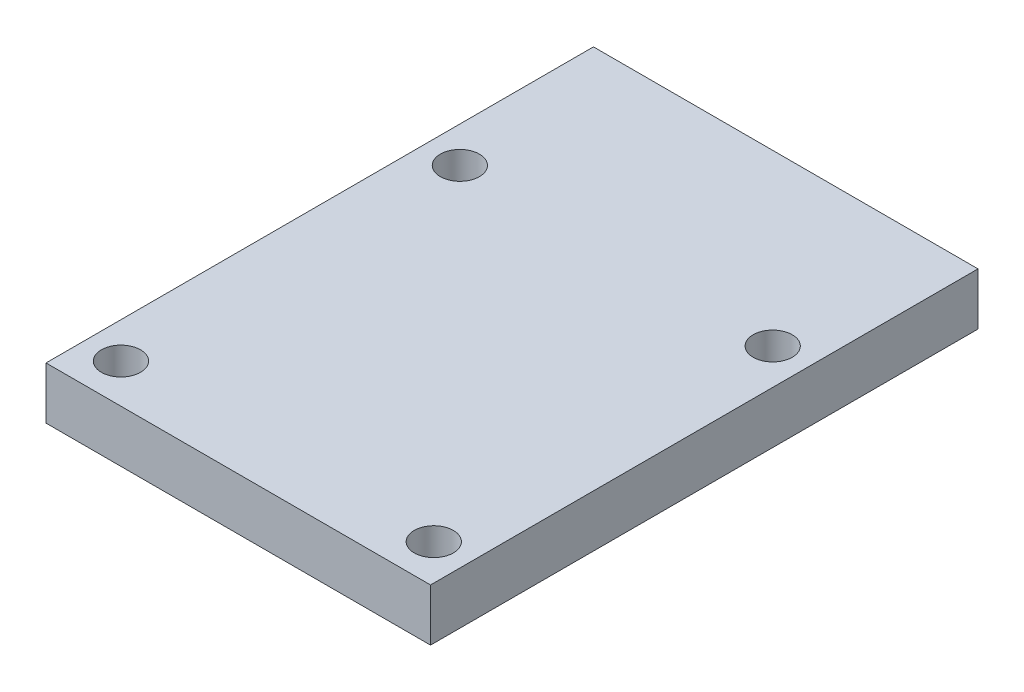
ISO-10303-21;
HEADER;
FILE_DESCRIPTION(('STEP AP214'),'2;1');
FILE_NAME('part.step','',(''),(''),'','','');
FILE_SCHEMA(('AUTOMOTIVE_DESIGN { 1 0 10303 214 1 1 1 1 }'));
ENDSEC;
DATA;
#1=APPLICATION_CONTEXT('core data for automotive mechanical design processes');
#2=APPLICATION_PROTOCOL_DEFINITION('international standard','automotive_design',2000,#1);
#3=PRODUCT_CONTEXT('',#1,'mechanical');
#4=PRODUCT('Part','Part','',(#3));
#5=PRODUCT_RELATED_PRODUCT_CATEGORY('part','',(#4));
#6=PRODUCT_DEFINITION_FORMATION('','',#4);
#7=PRODUCT_DEFINITION_CONTEXT('part definition',#1,'design');
#8=PRODUCT_DEFINITION('design','',#6,#7);
#9=PRODUCT_DEFINITION_SHAPE('','',#8);
#10=(LENGTH_UNIT() NAMED_UNIT(*) SI_UNIT(.MILLI.,.METRE.));
#11=(NAMED_UNIT(*) PLANE_ANGLE_UNIT() SI_UNIT($,.RADIAN.));
#12=(NAMED_UNIT(*) SI_UNIT($,.STERADIAN.) SOLID_ANGLE_UNIT());
#13=UNCERTAINTY_MEASURE_WITH_UNIT(LENGTH_MEASURE(1.E-05),#10,'distance_accuracy_value','');
#14=(GEOMETRIC_REPRESENTATION_CONTEXT(3) GLOBAL_UNCERTAINTY_ASSIGNED_CONTEXT((#13)) GLOBAL_UNIT_ASSIGNED_CONTEXT((#10,
#11,#12)) REPRESENTATION_CONTEXT('',''));
#15=CARTESIAN_POINT('',(0.,0.,0.));
#16=DIRECTION('',(0.,0.,1.));
#17=DIRECTION('',(1.,0.,0.));
#18=AXIS2_PLACEMENT_3D('',#15,#16,#17);
#19=CARTESIAN_POINT('',(0.,4.,0.));
#20=DIRECTION('',(0.,-1.,0.));
#21=DIRECTION('',(0.,0.,-1.));
#22=AXIS2_PLACEMENT_3D('',#19,#20,#21);
#23=PLANE('',#22);
#24=DIRECTION('',(0.,0.,-1.));
#25=VECTOR('',#24,1.);
#26=CARTESIAN_POINT('',(14.75,4.,21.));
#27=LINE('',#26,#25);
#28=CARTESIAN_POINT('',(14.75,4.,21.));
#29=VERTEX_POINT('',#28);
#30=CARTESIAN_POINT('',(14.75,4.,-21.));
#31=VERTEX_POINT('',#30);
#32=EDGE_CURVE('E92',#29,#31,#27,.T.);
#33=ORIENTED_EDGE('',*,*,#32,.T.);
#34=DIRECTION('',(-1.,0.,0.));
#35=VECTOR('',#34,1.);
#36=CARTESIAN_POINT('',(-14.75,4.,-21.));
#37=LINE('',#36,#35);
#38=CARTESIAN_POINT('',(-14.75,4.,-21.));
#39=VERTEX_POINT('',#38);
#40=EDGE_CURVE('E87',#31,#39,#37,.T.);
#41=ORIENTED_EDGE('',*,*,#40,.T.);
#42=DIRECTION('',(0.,0.,1.));
#43=VECTOR('',#42,1.);
#44=CARTESIAN_POINT('',(-14.75,4.,21.));
#45=LINE('',#44,#43);
#46=CARTESIAN_POINT('',(-14.75,4.,21.));
#47=VERTEX_POINT('',#46);
#48=EDGE_CURVE('E90',#39,#47,#45,.T.);
#49=ORIENTED_EDGE('',*,*,#48,.T.);
#50=DIRECTION('',(1.,0.,0.));
#51=VECTOR('',#50,1.);
#52=CARTESIAN_POINT('',(-14.75,4.,21.));
#53=LINE('',#52,#51);
#54=EDGE_CURVE('E57',#47,#29,#53,.T.);
#55=ORIENTED_EDGE('',*,*,#54,.T.);
#56=EDGE_LOOP('',(#33,#41,#49,#55));
#57=FACE_BOUND('',#56,.T.);
#58=CARTESIAN_POINT('',(12.,4.,-8.));
#59=DIRECTION('',(0.,1.,0.));
#60=DIRECTION('',(0.,0.,1.));
#61=AXIS2_PLACEMENT_3D('',#58,#59,#60);
#62=CIRCLE('',#61,1.5);
#63=CARTESIAN_POINT('',(12.,4.,-6.5));
#64=VERTEX_POINT('',#63);
#65=EDGE_CURVE('E107',#64,#64,#62,.T.);
#66=ORIENTED_EDGE('',*,*,#65,.F.);
#67=EDGE_LOOP('',(#66));
#68=FACE_BOUND('',#67,.T.);
#69=CARTESIAN_POINT('',(12.,4.,18.));
#70=DIRECTION('',(0.,1.,0.));
#71=DIRECTION('',(0.,0.,-1.));
#72=AXIS2_PLACEMENT_3D('',#69,#70,#71);
#73=CIRCLE('',#72,1.5);
#74=CARTESIAN_POINT('',(12.,4.,16.5));
#75=VERTEX_POINT('',#74);
#76=EDGE_CURVE('E122',#75,#75,#73,.T.);
#77=ORIENTED_EDGE('',*,*,#76,.F.);
#78=EDGE_LOOP('',(#77));
#79=FACE_BOUND('',#78,.T.);
#80=CARTESIAN_POINT('',(-12.,4.,18.));
#81=DIRECTION('',(0.,1.,0.));
#82=DIRECTION('',(0.,0.,1.));
#83=AXIS2_PLACEMENT_3D('',#80,#81,#82);
#84=CIRCLE('',#83,1.5);
#85=CARTESIAN_POINT('',(-12.,4.,19.5));
#86=VERTEX_POINT('',#85);
#87=EDGE_CURVE('E128',#86,#86,#84,.T.);
#88=ORIENTED_EDGE('',*,*,#87,.F.);
#89=EDGE_LOOP('',(#88));
#90=FACE_BOUND('',#89,.T.);
#91=CARTESIAN_POINT('',(-12.,4.,-8.));
#92=DIRECTION('',(0.,1.,0.));
#93=DIRECTION('',(0.,0.,-1.));
#94=AXIS2_PLACEMENT_3D('',#91,#92,#93);
#95=CIRCLE('',#94,1.5);
#96=CARTESIAN_POINT('',(-12.,4.,-9.5));
#97=VERTEX_POINT('',#96);
#98=EDGE_CURVE('E134',#97,#97,#95,.T.);
#99=ORIENTED_EDGE('',*,*,#98,.F.);
#100=EDGE_LOOP('',(#99));
#101=FACE_BOUND('',#100,.T.);
#102=ADVANCED_FACE('F40',(#57,#68,#79,#90,#101),#23,.F.);
#103=CARTESIAN_POINT('',(0.,0.,0.));
#104=DIRECTION('',(0.,-1.,0.));
#105=DIRECTION('',(0.,0.,-1.));
#106=AXIS2_PLACEMENT_3D('',#103,#104,#105);
#107=PLANE('',#106);
#108=CARTESIAN_POINT('',(-12.,0.,18.));
#109=DIRECTION('',(0.,1.,0.));
#110=DIRECTION('',(0.,0.,1.));
#111=AXIS2_PLACEMENT_3D('',#108,#109,#110);
#112=CIRCLE('',#111,1.5);
#113=CARTESIAN_POINT('',(-12.,0.,19.5));
#114=VERTEX_POINT('',#113);
#115=EDGE_CURVE('E131',#114,#114,#112,.T.);
#116=ORIENTED_EDGE('',*,*,#115,.T.);
#117=EDGE_LOOP('',(#116));
#118=FACE_BOUND('',#117,.T.);
#119=CARTESIAN_POINT('',(12.,0.,-8.));
#120=DIRECTION('',(0.,1.,0.));
#121=DIRECTION('',(0.,0.,1.));
#122=AXIS2_PLACEMENT_3D('',#119,#120,#121);
#123=CIRCLE('',#122,1.5);
#124=CARTESIAN_POINT('',(12.,0.,-6.5));
#125=VERTEX_POINT('',#124);
#126=EDGE_CURVE('E119',#125,#125,#123,.T.);
#127=ORIENTED_EDGE('',*,*,#126,.T.);
#128=EDGE_LOOP('',(#127));
#129=FACE_BOUND('',#128,.T.);
#130=DIRECTION('',(0.,0.,-1.));
#131=VECTOR('',#130,1.);
#132=CARTESIAN_POINT('',(14.75,0.,21.));
#133=LINE('',#132,#131);
#134=CARTESIAN_POINT('',(14.75,0.,21.));
#135=VERTEX_POINT('',#134);
#136=CARTESIAN_POINT('',(14.75,0.,-21.));
#137=VERTEX_POINT('',#136);
#138=EDGE_CURVE('E104',#135,#137,#133,.T.);
#139=ORIENTED_EDGE('',*,*,#138,.F.);
#140=DIRECTION('',(1.,0.,0.));
#141=VECTOR('',#140,1.);
#142=CARTESIAN_POINT('',(-14.75,0.,21.));
#143=LINE('',#142,#141);
#144=CARTESIAN_POINT('',(-14.75,0.,21.));
#145=VERTEX_POINT('',#144);
#146=EDGE_CURVE('E80',#145,#135,#143,.T.);
#147=ORIENTED_EDGE('',*,*,#146,.F.);
#148=DIRECTION('',(0.,0.,1.));
#149=VECTOR('',#148,1.);
#150=CARTESIAN_POINT('',(-14.75,0.,21.));
#151=LINE('',#150,#149);
#152=CARTESIAN_POINT('',(-14.75,0.,-21.));
#153=VERTEX_POINT('',#152);
#154=EDGE_CURVE('E74',#153,#145,#151,.T.);
#155=ORIENTED_EDGE('',*,*,#154,.F.);
#156=DIRECTION('',(-1.,0.,0.));
#157=VECTOR('',#156,1.);
#158=CARTESIAN_POINT('',(-14.75,0.,-21.));
#159=LINE('',#158,#157);
#160=EDGE_CURVE('E96',#137,#153,#159,.T.);
#161=ORIENTED_EDGE('',*,*,#160,.F.);
#162=EDGE_LOOP('',(#139,#147,#155,#161));
#163=FACE_BOUND('',#162,.T.);
#164=CARTESIAN_POINT('',(12.,0.,18.));
#165=DIRECTION('',(0.,1.,0.));
#166=DIRECTION('',(0.,0.,-1.));
#167=AXIS2_PLACEMENT_3D('',#164,#165,#166);
#168=CIRCLE('',#167,1.5);
#169=CARTESIAN_POINT('',(12.,0.,16.5));
#170=VERTEX_POINT('',#169);
#171=EDGE_CURVE('E125',#170,#170,#168,.T.);
#172=ORIENTED_EDGE('',*,*,#171,.T.);
#173=EDGE_LOOP('',(#172));
#174=FACE_BOUND('',#173,.T.);
#175=CARTESIAN_POINT('',(-12.,0.,-8.));
#176=DIRECTION('',(0.,1.,0.));
#177=DIRECTION('',(0.,0.,-1.));
#178=AXIS2_PLACEMENT_3D('',#175,#176,#177);
#179=CIRCLE('',#178,1.5);
#180=CARTESIAN_POINT('',(-12.,0.,-9.5));
#181=VERTEX_POINT('',#180);
#182=EDGE_CURVE('E137',#181,#181,#179,.T.);
#183=ORIENTED_EDGE('',*,*,#182,.T.);
#184=EDGE_LOOP('',(#183));
#185=FACE_BOUND('',#184,.T.);
#186=ADVANCED_FACE('F115',(#118,#129,#163,#174,#185),#107,.T.);
#187=CARTESIAN_POINT('',(14.75,4.,21.));
#188=DIRECTION('',(-1.,0.,0.));
#189=DIRECTION('',(0.,0.,1.));
#190=AXIS2_PLACEMENT_3D('',#187,#188,#189);
#191=PLANE('',#190);
#192=ORIENTED_EDGE('',*,*,#138,.T.);
#193=DIRECTION('',(0.,-1.,0.));
#194=VECTOR('',#193,1.);
#195=CARTESIAN_POINT('',(14.75,4.,-21.));
#196=LINE('',#195,#194);
#197=EDGE_CURVE('E11',#31,#137,#196,.T.);
#198=ORIENTED_EDGE('',*,*,#197,.F.);
#199=ORIENTED_EDGE('',*,*,#32,.F.);
#200=DIRECTION('',(0.,-1.,0.));
#201=VECTOR('',#200,1.);
#202=CARTESIAN_POINT('',(14.75,4.,21.));
#203=LINE('',#202,#201);
#204=EDGE_CURVE('E100',#29,#135,#203,.T.);
#205=ORIENTED_EDGE('',*,*,#204,.T.);
#206=EDGE_LOOP('',(#192,#198,#199,#205));
#207=FACE_BOUND('',#206,.T.);
#208=ADVANCED_FACE('F42',(#207),#191,.F.);
#209=CARTESIAN_POINT('',(-14.75,4.,-21.));
#210=DIRECTION('',(0.,0.,1.));
#211=DIRECTION('',(1.,0.,0.));
#212=AXIS2_PLACEMENT_3D('',#209,#210,#211);
#213=PLANE('',#212);
#214=ORIENTED_EDGE('',*,*,#160,.T.);
#215=DIRECTION('',(0.,-1.,0.));
#216=VECTOR('',#215,1.);
#217=CARTESIAN_POINT('',(-14.75,4.,-21.));
#218=LINE('',#217,#216);
#219=EDGE_CURVE('E49',#39,#153,#218,.T.);
#220=ORIENTED_EDGE('',*,*,#219,.F.);
#221=ORIENTED_EDGE('',*,*,#40,.F.);
#222=ORIENTED_EDGE('',*,*,#197,.T.);
#223=EDGE_LOOP('',(#214,#220,#221,#222));
#224=FACE_BOUND('',#223,.T.);
#225=ADVANCED_FACE('F95',(#224),#213,.F.);
#226=CARTESIAN_POINT('',(-14.75,4.,21.));
#227=DIRECTION('',(1.,0.,0.));
#228=DIRECTION('',(0.,0.,-1.));
#229=AXIS2_PLACEMENT_3D('',#226,#227,#228);
#230=PLANE('',#229);
#231=ORIENTED_EDGE('',*,*,#154,.T.);
#232=DIRECTION('',(0.,-1.,0.));
#233=VECTOR('',#232,1.);
#234=CARTESIAN_POINT('',(-14.75,4.,21.));
#235=LINE('',#234,#233);
#236=EDGE_CURVE('E97',#47,#145,#235,.T.);
#237=ORIENTED_EDGE('',*,*,#236,.F.);
#238=ORIENTED_EDGE('',*,*,#48,.F.);
#239=ORIENTED_EDGE('',*,*,#219,.T.);
#240=EDGE_LOOP('',(#231,#237,#238,#239));
#241=FACE_BOUND('',#240,.T.);
#242=ADVANCED_FACE('F98',(#241),#230,.F.);
#243=CARTESIAN_POINT('',(-14.75,4.,21.));
#244=DIRECTION('',(0.,0.,-1.));
#245=DIRECTION('',(-1.,0.,0.));
#246=AXIS2_PLACEMENT_3D('',#243,#244,#245);
#247=PLANE('',#246);
#248=ORIENTED_EDGE('',*,*,#146,.T.);
#249=ORIENTED_EDGE('',*,*,#204,.F.);
#250=ORIENTED_EDGE('',*,*,#54,.F.);
#251=ORIENTED_EDGE('',*,*,#236,.T.);
#252=EDGE_LOOP('',(#248,#249,#250,#251));
#253=FACE_BOUND('',#252,.T.);
#254=ADVANCED_FACE('F112',(#253),#247,.F.);
#255=CARTESIAN_POINT('',(12.,4.,-8.));
#256=DIRECTION('',(0.,-1.,0.));
#257=DIRECTION('',(0.,0.,-1.));
#258=AXIS2_PLACEMENT_3D('',#255,#256,#257);
#259=CYLINDRICAL_SURFACE('',#258,1.5);
#260=ORIENTED_EDGE('',*,*,#65,.T.);
#261=EDGE_LOOP('',(#260));
#262=FACE_BOUND('',#261,.T.);
#263=ORIENTED_EDGE('',*,*,#126,.F.);
#264=EDGE_LOOP('',(#263));
#265=FACE_BOUND('',#264,.T.);
#266=ADVANCED_FACE('F154',(#262,#265),#259,.F.);
#267=CARTESIAN_POINT('',(12.,4.,18.));
#268=DIRECTION('',(0.,-1.,0.));
#269=DIRECTION('',(0.,0.,-1.));
#270=AXIS2_PLACEMENT_3D('',#267,#268,#269);
#271=CYLINDRICAL_SURFACE('',#270,1.5);
#272=ORIENTED_EDGE('',*,*,#76,.T.);
#273=EDGE_LOOP('',(#272));
#274=FACE_BOUND('',#273,.T.);
#275=ORIENTED_EDGE('',*,*,#171,.F.);
#276=EDGE_LOOP('',(#275));
#277=FACE_BOUND('',#276,.T.);
#278=ADVANCED_FACE('F208',(#274,#277),#271,.F.);
#279=CARTESIAN_POINT('',(-12.,4.,18.));
#280=DIRECTION('',(0.,-1.,0.));
#281=DIRECTION('',(0.,0.,-1.));
#282=AXIS2_PLACEMENT_3D('',#279,#280,#281);
#283=CYLINDRICAL_SURFACE('',#282,1.5);
#284=ORIENTED_EDGE('',*,*,#87,.T.);
#285=EDGE_LOOP('',(#284));
#286=FACE_BOUND('',#285,.T.);
#287=ORIENTED_EDGE('',*,*,#115,.F.);
#288=EDGE_LOOP('',(#287));
#289=FACE_BOUND('',#288,.T.);
#290=ADVANCED_FACE('F217',(#286,#289),#283,.F.);
#291=CARTESIAN_POINT('',(-12.,4.,-8.));
#292=DIRECTION('',(0.,-1.,0.));
#293=DIRECTION('',(0.,0.,-1.));
#294=AXIS2_PLACEMENT_3D('',#291,#292,#293);
#295=CYLINDRICAL_SURFACE('',#294,1.5);
#296=ORIENTED_EDGE('',*,*,#98,.T.);
#297=EDGE_LOOP('',(#296));
#298=FACE_BOUND('',#297,.T.);
#299=ORIENTED_EDGE('',*,*,#182,.F.);
#300=EDGE_LOOP('',(#299));
#301=FACE_BOUND('',#300,.T.);
#302=ADVANCED_FACE('F143',(#298,#301),#295,.F.);
#303=CLOSED_SHELL('',(#102,#186,#208,#225,#242,#254,#266,#278,#290,#302));
#304=MANIFOLD_SOLID_BREP('B2',#303);
#305=ADVANCED_BREP_SHAPE_REPRESENTATION('',(#18,#304),#14);
#306=SHAPE_DEFINITION_REPRESENTATION(#9,#305);
ENDSEC;
END-ISO-10303-21;
